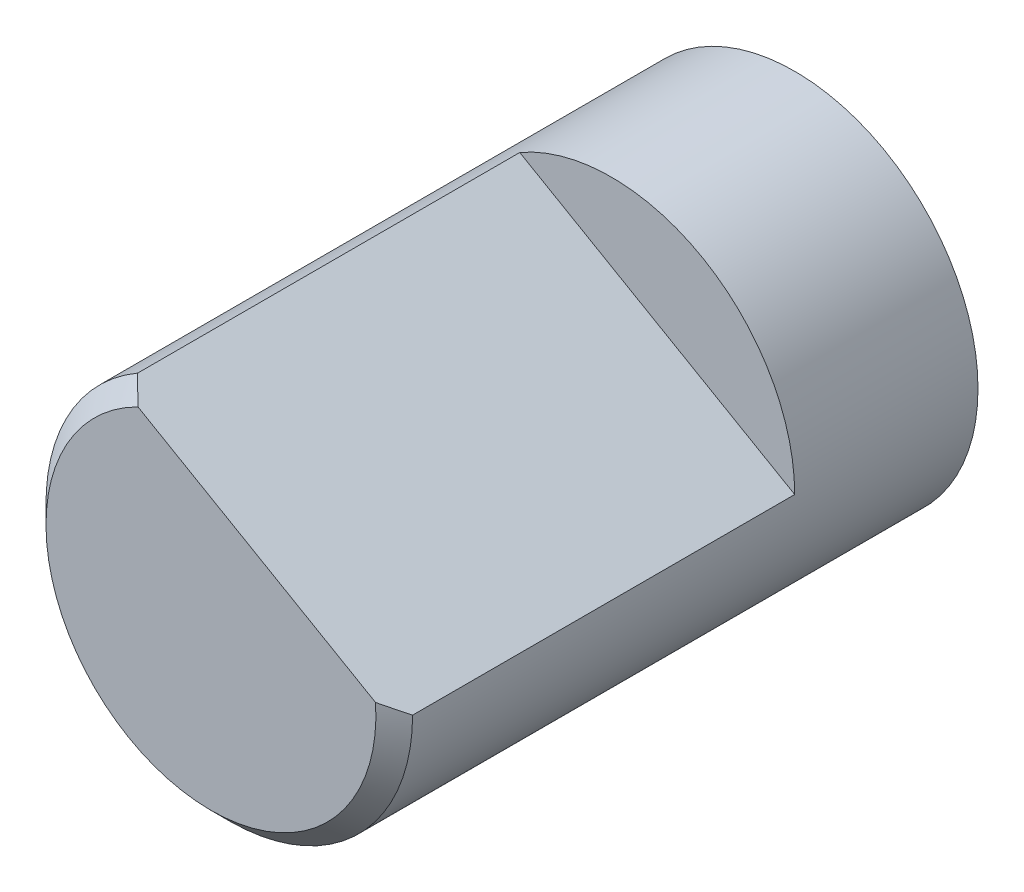
ISO-10303-21;
HEADER;
FILE_DESCRIPTION(('STEP AP214'),'2;1');
FILE_NAME('part.step','',(''),(''),'','','');
FILE_SCHEMA(('AUTOMOTIVE_DESIGN { 1 0 10303 214 1 1 1 1 }'));
ENDSEC;
DATA;
#1=APPLICATION_CONTEXT('core data for automotive mechanical design processes');
#2=APPLICATION_PROTOCOL_DEFINITION('international standard','automotive_design',2000,#1);
#3=PRODUCT_CONTEXT('',#1,'mechanical');
#4=PRODUCT('Part','Part','',(#3));
#5=PRODUCT_RELATED_PRODUCT_CATEGORY('part','',(#4));
#6=PRODUCT_DEFINITION_FORMATION('','',#4);
#7=PRODUCT_DEFINITION_CONTEXT('part definition',#1,'design');
#8=PRODUCT_DEFINITION('design','',#6,#7);
#9=PRODUCT_DEFINITION_SHAPE('','',#8);
#10=(LENGTH_UNIT() NAMED_UNIT(*) SI_UNIT(.MILLI.,.METRE.));
#11=(NAMED_UNIT(*) PLANE_ANGLE_UNIT() SI_UNIT($,.RADIAN.));
#12=(NAMED_UNIT(*) SI_UNIT($,.STERADIAN.) SOLID_ANGLE_UNIT());
#13=UNCERTAINTY_MEASURE_WITH_UNIT(LENGTH_MEASURE(1.E-05),#10,'distance_accuracy_value','');
#14=(GEOMETRIC_REPRESENTATION_CONTEXT(3) GLOBAL_UNCERTAINTY_ASSIGNED_CONTEXT((#13)) GLOBAL_UNIT_ASSIGNED_CONTEXT((#10,
#11,#12)) REPRESENTATION_CONTEXT('',''));
#15=CARTESIAN_POINT('',(0.,0.,0.));
#16=DIRECTION('',(0.,0.,1.));
#17=DIRECTION('',(1.,0.,0.));
#18=AXIS2_PLACEMENT_3D('',#15,#16,#17);
#19=CARTESIAN_POINT('',(-4.87208475865081,-1.93069837701578,14.5541999999999));
#20=DIRECTION('',(0.,0.,1.));
#21=DIRECTION('',(1.,0.,0.));
#22=AXIS2_PLACEMENT_3D('',#19,#20,#21);
#23=PLANE('',#22);
#24=DIRECTION('',(-0.866025405990496,0.499999996178997,0.));
#25=VECTOR('',#24,1.);
#26=CARTESIAN_POINT('',(11.9650290018449,-5.17596184153288,14.5541999999999));
#27=LINE('',#26,#25);
#28=CARTESIAN_POINT('',(2.69422220874423,0.176540901530306,14.5541999999999));
#29=VERTEX_POINT('',#28);
#30=CARTESIAN_POINT('',(-1.19422222020804,2.42153531643979,14.5541999999999));
#31=VERTEX_POINT('',#30);
#32=EDGE_CURVE('E82',#29,#31,#27,.T.);
#33=ORIENTED_EDGE('',*,*,#32,.T.);
#34=CARTESIAN_POINT('',(0.,0.,14.5541999999999));
#35=DIRECTION('',(0.,0.,1.));
#36=DIRECTION('',(1.,0.,0.));
#37=AXIS2_PLACEMENT_3D('',#34,#35,#36);
#38=CIRCLE('',#37,2.7000000000007);
#39=EDGE_CURVE('E11',#31,#29,#38,.T.);
#40=ORIENTED_EDGE('',*,*,#39,.T.);
#41=EDGE_LOOP('',(#33,#40));
#42=FACE_BOUND('',#41,.T.);
#43=ADVANCED_FACE('F38',(#42),#23,.T.);
#44=CARTESIAN_POINT('',(14.1058500458838,-1.4679509855613,8.00000000000102));
#45=DIRECTION('',(0.,0.,-1.));
#46=DIRECTION('',(-1.,0.,0.));
#47=AXIS2_PLACEMENT_3D('',#44,#45,#46);
#48=PLANE('',#47);
#49=DIRECTION('',(-0.866025405990512,0.499999996178969,0.));
#50=VECTOR('',#49,1.);
#51=CARTESIAN_POINT('',(3.0000000000007,1.32372856165991E-08,8.00000000000102));
#52=LINE('',#51,#50);
#53=CARTESIAN_POINT('',(3.00000000000021,1.32364323494893E-08,8.00000000000102));
#54=VERTEX_POINT('',#53);
#55=CARTESIAN_POINT('',(-1.50000001146272,2.59807620473612,8.00000000000102));
#56=VERTEX_POINT('',#55);
#57=EDGE_CURVE('E85',#54,#56,#52,.T.);
#58=ORIENTED_EDGE('',*,*,#57,.F.);
#59=CARTESIAN_POINT('',(0.,0.,8.00000000000102));
#60=DIRECTION('',(0.,0.,1.));
#61=DIRECTION('',(1.,0.,0.));
#62=AXIS2_PLACEMENT_3D('',#59,#60,#61);
#63=CIRCLE('',#62,3.0000000000007);
#64=EDGE_CURVE('E72',#56,#54,#63,.F.);
#65=ORIENTED_EDGE('',*,*,#64,.F.);
#66=EDGE_LOOP('',(#58,#65));
#67=FACE_BOUND('',#66,.T.);
#68=ADVANCED_FACE('F90',(#67),#48,.F.);
#69=CARTESIAN_POINT('',(11.9650290018449,-5.17596184153288,8.00000000000102));
#70=DIRECTION('',(-0.499999996178997,-0.866025405990496,0.));
#71=DIRECTION('',(0.866025405990496,-0.499999996178997,0.));
#72=AXIS2_PLACEMENT_3D('',#69,#70,#71);
#73=PLANE('',#72);
#74=DIRECTION('',(0.,0.,1.));
#75=VECTOR('',#74,1.);
#76=CARTESIAN_POINT('',(-1.50000001146272,2.59807620473612,5.00000000000032));
#77=LINE('',#76,#75);
#78=CARTESIAN_POINT('',(-1.50000001146272,2.59807620473612,14.2541999999999));
#79=VERTEX_POINT('',#78);
#80=EDGE_CURVE('E78',#79,#56,#77,.F.);
#81=ORIENTED_EDGE('',*,*,#80,.F.);
#82=CARTESIAN_POINT('',(-1.50000001146272,2.59807620473612,14.2541999999999));
#83=CARTESIAN_POINT('',(-1.47472292707921,2.58348247341035,14.2794766928579));
#84=CARTESIAN_POINT('',(-1.44940049220609,2.56886255896824,14.3046930274605));
#85=CARTESIAN_POINT('',(-1.3986570223395,2.53956580327926,14.3549915633156));
#86=CARTESIAN_POINT('',(-1.37323598983163,2.52488896346746,14.380073767912));
#87=CARTESIAN_POINT('',(-1.32228606381192,2.49547301026463,14.4300919890123));
#88=CARTESIAN_POINT('',(-1.29675716989258,2.48073389663834,14.4550280049632));
#89=CARTESIAN_POINT('',(-1.24558090987889,2.45118726944432,14.5047388930943));
#90=CARTESIAN_POINT('',(-1.21993354083187,2.43637975417186,14.529513761221));
#91=CARTESIAN_POINT('',(-1.19422222020804,2.42153531643979,14.5541999999999));
#92=B_SPLINE_CURVE_WITH_KNOTS('',3,(#82,#83,#84,#85,#86,#87,#88,#89,#90,#91),.UNSPECIFIED.,.F.,
.F.,(4,2,2,2,4),(0.,0.115833403881911,0.23166390639617,0.347494846901969,0.463328689920926),.UNSPECIFIED.);
#93=EDGE_CURVE('E48',#79,#31,#92,.T.);
#94=ORIENTED_EDGE('',*,*,#93,.T.);
#95=ORIENTED_EDGE('',*,*,#32,.F.);
#96=CARTESIAN_POINT('',(2.69422220874423,0.176540901530305,14.5541999999999));
#97=CARTESIAN_POINT('',(2.71993352936805,0.161696463798178,14.529513761221));
#98=CARTESIAN_POINT('',(2.74558089841512,0.146888948525726,14.5047388930943));
#99=CARTESIAN_POINT('',(2.79675715842891,0.117342321331706,14.4550280049631));
#100=CARTESIAN_POINT('',(2.8222860523483,0.102603207705415,14.4300919890122));
#101=CARTESIAN_POINT('',(2.873235978368,0.0731872545024751,14.3800737679118));
#102=CARTESIAN_POINT('',(2.89865701087581,0.0585104146905609,14.3549915633153));
#103=CARTESIAN_POINT('',(2.94940048074271,0.0292136590018091,14.3046930274603));
#104=CARTESIAN_POINT('',(2.97472291561619,0.014593744560033,14.2794766928577));
#105=CARTESIAN_POINT('',(3.00000000000056,1.32350917529563E-08,14.2542));
#106=B_SPLINE_CURVE_WITH_KNOTS('',3,(#96,#97,#98,#99,#100,#101,#102,#103,#104,#105),
.UNSPECIFIED.,.F.,.F.,(4,2,2,2,4),(0.,0.115833843019097,0.231664783525042,0.347495286039441,
0.463328689921491),.UNSPECIFIED.);
#107=CARTESIAN_POINT('',(2.99999999999971,1.323557929922E-08,14.2541999999999));
#108=VERTEX_POINT('',#107);
#109=EDGE_CURVE('E87',#29,#108,#106,.T.);
#110=ORIENTED_EDGE('',*,*,#109,.T.);
#111=DIRECTION('',(0.,0.,1.));
#112=VECTOR('',#111,1.);
#113=CARTESIAN_POINT('',(2.99999999999971,1.323557929922E-08,8.00000000000102));
#114=LINE('',#113,#112);
#115=EDGE_CURVE('E76',#54,#108,#114,.T.);
#116=ORIENTED_EDGE('',*,*,#115,.F.);
#117=ORIENTED_EDGE('',*,*,#57,.T.);
#118=EDGE_LOOP('',(#81,#94,#95,#110,#116,#117));
#119=FACE_BOUND('',#118,.T.);
#120=ADVANCED_FACE('F84',(#119),#73,.F.);
#121=CARTESIAN_POINT('',(0.,0.,5.00000000000032));
#122=DIRECTION('',(0.,0.,1.));
#123=DIRECTION('',(1.,0.,0.));
#124=AXIS2_PLACEMENT_3D('',#121,#122,#123);
#125=PLANE('',#124);
#126=CARTESIAN_POINT('',(0.,0.,5.00000000000032));
#127=DIRECTION('',(0.,0.,1.));
#128=DIRECTION('',(1.,0.,0.));
#129=AXIS2_PLACEMENT_3D('',#126,#127,#128);
#130=CIRCLE('',#129,3.0000000000007);
#131=CARTESIAN_POINT('',(3.0000000000007,0.,5.00000000000032));
#132=VERTEX_POINT('',#131);
#133=EDGE_CURVE('E91',#132,#132,#130,.T.);
#134=ORIENTED_EDGE('',*,*,#133,.F.);
#135=EDGE_LOOP('',(#134));
#136=FACE_BOUND('',#135,.T.);
#137=ADVANCED_FACE('F110',(#136),#125,.F.);
#138=CARTESIAN_POINT('',(0.,0.,5.00000000000032));
#139=DIRECTION('',(0.,0.,1.));
#140=DIRECTION('',(1.,0.,0.));
#141=AXIS2_PLACEMENT_3D('',#138,#139,#140);
#142=CYLINDRICAL_SURFACE('',#141,3.0000000000007);
#143=ORIENTED_EDGE('',*,*,#133,.T.);
#144=EDGE_LOOP('',(#143));
#145=FACE_BOUND('',#144,.T.);
#146=ORIENTED_EDGE('',*,*,#115,.T.);
#147=CARTESIAN_POINT('',(0.,0.,14.2541999999999));
#148=DIRECTION('',(0.,0.,1.));
#149=DIRECTION('',(1.,0.,0.));
#150=AXIS2_PLACEMENT_3D('',#147,#148,#149);
#151=CIRCLE('',#150,3.0000000000007);
#152=EDGE_CURVE('E88',#108,#79,#151,.F.);
#153=ORIENTED_EDGE('',*,*,#152,.T.);
#154=ORIENTED_EDGE('',*,*,#80,.T.);
#155=ORIENTED_EDGE('',*,*,#64,.T.);
#156=EDGE_LOOP('',(#146,#153,#154,#155));
#157=FACE_BOUND('',#156,.T.);
#158=ADVANCED_FACE('F74',(#145,#157),#142,.T.);
#159=CARTESIAN_POINT('',(0.,0.,14.2541999999999));
#160=DIRECTION('',(0.,0.,-1.));
#161=DIRECTION('',(-1.,0.,0.));
#162=AXIS2_PLACEMENT_3D('',#159,#160,#161);
#163=CONICAL_SURFACE('',#162,3.0000000000007,0.785398163397452);
#164=ORIENTED_EDGE('',*,*,#109,.F.);
#165=ORIENTED_EDGE('',*,*,#39,.F.);
#166=ORIENTED_EDGE('',*,*,#93,.F.);
#167=ORIENTED_EDGE('',*,*,#152,.F.);
#168=EDGE_LOOP('',(#164,#165,#166,#167));
#169=FACE_BOUND('',#168,.T.);
#170=ADVANCED_FACE('F41',(#169),#163,.T.);
#171=CLOSED_SHELL('',(#43,#68,#120,#137,#158,#170));
#172=MANIFOLD_SOLID_BREP('B2',#171);
#173=ADVANCED_BREP_SHAPE_REPRESENTATION('',(#18,#172),#14);
#174=SHAPE_DEFINITION_REPRESENTATION(#9,#173);
ENDSEC;
END-ISO-10303-21;
